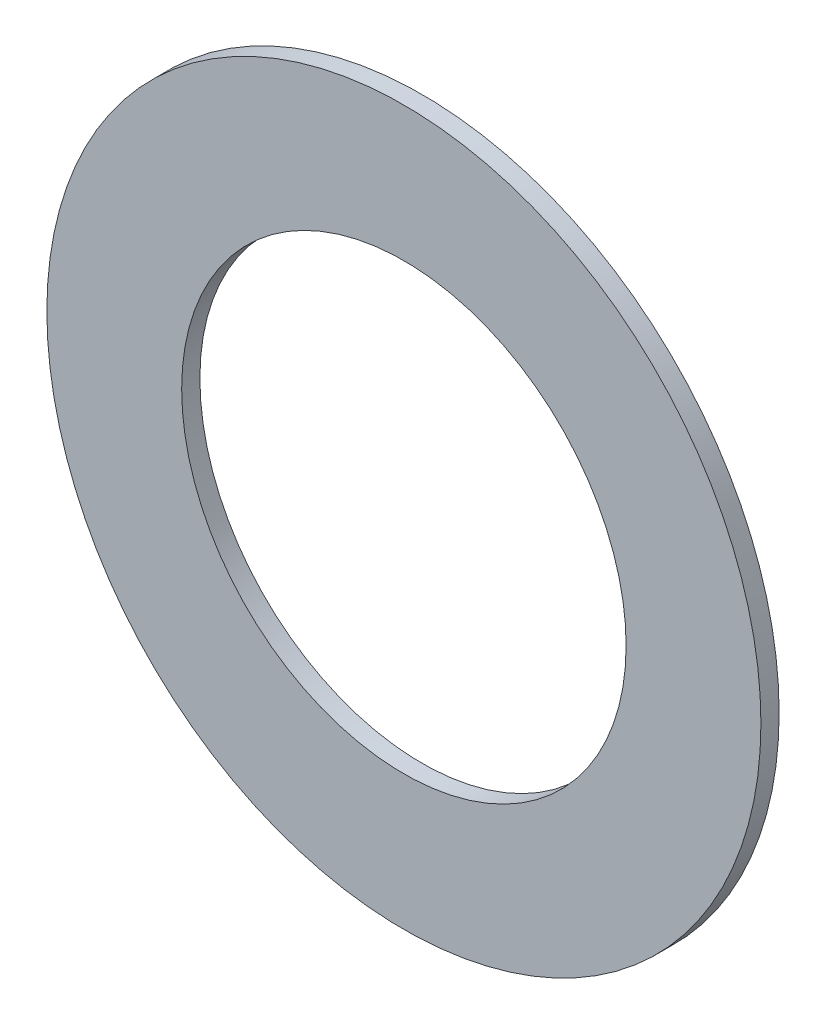
ISO-10303-21;
HEADER;
FILE_DESCRIPTION(('STEP AP214'),'2;1');
FILE_NAME('part.step','',(''),(''),'','','');
FILE_SCHEMA(('AUTOMOTIVE_DESIGN { 1 0 10303 214 1 1 1 1 }'));
ENDSEC;
DATA;
#1=APPLICATION_CONTEXT('core data for automotive mechanical design processes');
#2=APPLICATION_PROTOCOL_DEFINITION('international standard','automotive_design',2000,#1);
#3=PRODUCT_CONTEXT('',#1,'mechanical');
#4=PRODUCT('Part','Part','',(#3));
#5=PRODUCT_RELATED_PRODUCT_CATEGORY('part','',(#4));
#6=PRODUCT_DEFINITION_FORMATION('','',#4);
#7=PRODUCT_DEFINITION_CONTEXT('part definition',#1,'design');
#8=PRODUCT_DEFINITION('design','',#6,#7);
#9=PRODUCT_DEFINITION_SHAPE('','',#8);
#10=(LENGTH_UNIT() NAMED_UNIT(*) SI_UNIT(.MILLI.,.METRE.));
#11=(NAMED_UNIT(*) PLANE_ANGLE_UNIT() SI_UNIT($,.RADIAN.));
#12=(NAMED_UNIT(*) SI_UNIT($,.STERADIAN.) SOLID_ANGLE_UNIT());
#13=UNCERTAINTY_MEASURE_WITH_UNIT(LENGTH_MEASURE(1.E-05),#10,'distance_accuracy_value','');
#14=(GEOMETRIC_REPRESENTATION_CONTEXT(3) GLOBAL_UNCERTAINTY_ASSIGNED_CONTEXT((#13)) GLOBAL_UNIT_ASSIGNED_CONTEXT((#10,
#11,#12)) REPRESENTATION_CONTEXT('',''));
#15=CARTESIAN_POINT('',(0.,0.,0.));
#16=DIRECTION('',(0.,0.,1.));
#17=DIRECTION('',(1.,0.,0.));
#18=AXIS2_PLACEMENT_3D('',#15,#16,#17);
#19=CARTESIAN_POINT('',(0.,0.,0.5));
#20=DIRECTION('',(0.,0.,1.));
#21=DIRECTION('',(1.,0.,0.));
#22=AXIS2_PLACEMENT_3D('',#19,#20,#21);
#23=PLANE('',#22);
#24=CARTESIAN_POINT('',(0.,0.,0.5));
#25=DIRECTION('',(0.,0.,1.));
#26=DIRECTION('',(1.,0.,0.));
#27=AXIS2_PLACEMENT_3D('',#24,#25,#26);
#28=CIRCLE('',#27,9.8);
#29=CARTESIAN_POINT('',(9.8,0.,0.5));
#30=VERTEX_POINT('',#29);
#31=EDGE_CURVE('E10',#30,#30,#28,.T.);
#32=ORIENTED_EDGE('',*,*,#31,.T.);
#33=EDGE_LOOP('',(#32));
#34=FACE_BOUND('',#33,.T.);
#35=CARTESIAN_POINT('',(0.,0.,0.5));
#36=DIRECTION('',(0.,0.,1.));
#37=DIRECTION('',(1.,0.,0.));
#38=AXIS2_PLACEMENT_3D('',#35,#36,#37);
#39=CIRCLE('',#38,6.1);
#40=CARTESIAN_POINT('',(6.1,0.,0.5));
#41=VERTEX_POINT('',#40);
#42=EDGE_CURVE('E44',#41,#41,#39,.T.);
#43=ORIENTED_EDGE('',*,*,#42,.F.);
#44=EDGE_LOOP('',(#43));
#45=FACE_BOUND('',#44,.T.);
#46=ADVANCED_FACE('F33',(#34,#45),#23,.T.);
#47=CARTESIAN_POINT('',(0.,0.,0.));
#48=DIRECTION('',(0.,0.,1.));
#49=DIRECTION('',(1.,0.,0.));
#50=AXIS2_PLACEMENT_3D('',#47,#48,#49);
#51=PLANE('',#50);
#52=CARTESIAN_POINT('',(0.,0.,0.));
#53=DIRECTION('',(0.,0.,1.));
#54=DIRECTION('',(1.,0.,0.));
#55=AXIS2_PLACEMENT_3D('',#52,#53,#54);
#56=CIRCLE('',#55,9.8);
#57=CARTESIAN_POINT('',(9.8,0.,0.));
#58=VERTEX_POINT('',#57);
#59=EDGE_CURVE('E40',#58,#58,#56,.T.);
#60=ORIENTED_EDGE('',*,*,#59,.F.);
#61=EDGE_LOOP('',(#60));
#62=FACE_BOUND('',#61,.T.);
#63=CARTESIAN_POINT('',(0.,0.,0.));
#64=DIRECTION('',(0.,0.,1.));
#65=DIRECTION('',(1.,0.,0.));
#66=AXIS2_PLACEMENT_3D('',#63,#64,#65);
#67=CIRCLE('',#66,6.1);
#68=CARTESIAN_POINT('',(6.1,0.,0.));
#69=VERTEX_POINT('',#68);
#70=EDGE_CURVE('E48',#69,#69,#67,.T.);
#71=ORIENTED_EDGE('',*,*,#70,.T.);
#72=EDGE_LOOP('',(#71));
#73=FACE_BOUND('',#72,.T.);
#74=ADVANCED_FACE('F54',(#62,#73),#51,.F.);
#75=CARTESIAN_POINT('',(0.,0.,0.5));
#76=DIRECTION('',(0.,0.,-1.));
#77=DIRECTION('',(-1.,0.,0.));
#78=AXIS2_PLACEMENT_3D('',#75,#76,#77);
#79=CYLINDRICAL_SURFACE('',#78,9.8);
#80=ORIENTED_EDGE('',*,*,#31,.F.);
#81=EDGE_LOOP('',(#80));
#82=FACE_BOUND('',#81,.T.);
#83=ORIENTED_EDGE('',*,*,#59,.T.);
#84=EDGE_LOOP('',(#83));
#85=FACE_BOUND('',#84,.T.);
#86=ADVANCED_FACE('F35',(#82,#85),#79,.T.);
#87=CARTESIAN_POINT('',(0.,0.,0.5));
#88=DIRECTION('',(0.,0.,-1.));
#89=DIRECTION('',(-1.,0.,0.));
#90=AXIS2_PLACEMENT_3D('',#87,#88,#89);
#91=CYLINDRICAL_SURFACE('',#90,6.1);
#92=ORIENTED_EDGE('',*,*,#42,.T.);
#93=EDGE_LOOP('',(#92));
#94=FACE_BOUND('',#93,.T.);
#95=ORIENTED_EDGE('',*,*,#70,.F.);
#96=EDGE_LOOP('',(#95));
#97=FACE_BOUND('',#96,.T.);
#98=ADVANCED_FACE('F56',(#94,#97),#91,.F.);
#99=CLOSED_SHELL('',(#46,#74,#86,#98));
#100=MANIFOLD_SOLID_BREP('B2',#99);
#101=ADVANCED_BREP_SHAPE_REPRESENTATION('',(#18,#100),#14);
#102=SHAPE_DEFINITION_REPRESENTATION(#9,#101);
ENDSEC;
END-ISO-10303-21;
